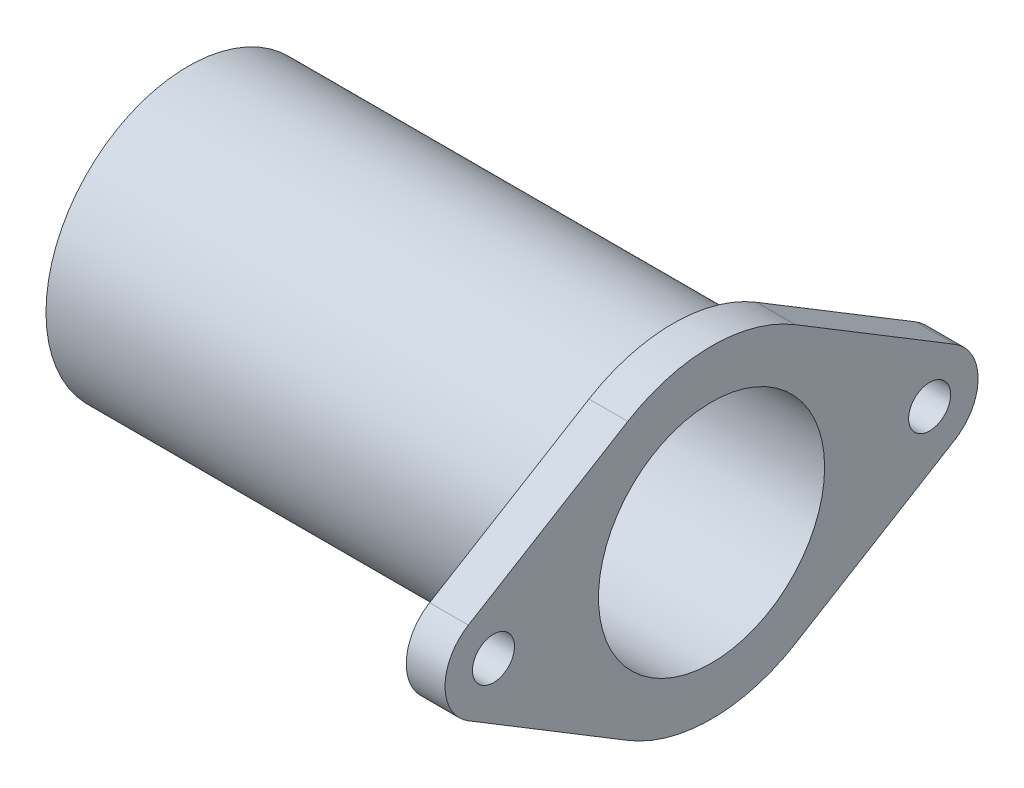
ISO-10303-21;
HEADER;
FILE_DESCRIPTION(('STEP AP214'),'2;1');
FILE_NAME('part.step','',(''),(''),'','','');
FILE_SCHEMA(('AUTOMOTIVE_DESIGN { 1 0 10303 214 1 1 1 1 }'));
ENDSEC;
DATA;
#1=APPLICATION_CONTEXT('core data for automotive mechanical design processes');
#2=APPLICATION_PROTOCOL_DEFINITION('international standard','automotive_design',2000,#1);
#3=PRODUCT_CONTEXT('',#1,'mechanical');
#4=PRODUCT('Part','Part','',(#3));
#5=PRODUCT_RELATED_PRODUCT_CATEGORY('part','',(#4));
#6=PRODUCT_DEFINITION_FORMATION('','',#4);
#7=PRODUCT_DEFINITION_CONTEXT('part definition',#1,'design');
#8=PRODUCT_DEFINITION('design','',#6,#7);
#9=PRODUCT_DEFINITION_SHAPE('','',#8);
#10=(LENGTH_UNIT() NAMED_UNIT(*) SI_UNIT(.MILLI.,.METRE.));
#11=(NAMED_UNIT(*) PLANE_ANGLE_UNIT() SI_UNIT($,.RADIAN.));
#12=(NAMED_UNIT(*) SI_UNIT($,.STERADIAN.) SOLID_ANGLE_UNIT());
#13=UNCERTAINTY_MEASURE_WITH_UNIT(LENGTH_MEASURE(1.E-05),#10,'distance_accuracy_value','');
#14=(GEOMETRIC_REPRESENTATION_CONTEXT(3) GLOBAL_UNCERTAINTY_ASSIGNED_CONTEXT((#13)) GLOBAL_UNIT_ASSIGNED_CONTEXT((#10,
#11,#12)) REPRESENTATION_CONTEXT('',''));
#15=CARTESIAN_POINT('',(0.,0.,0.));
#16=DIRECTION('',(0.,0.,1.));
#17=DIRECTION('',(1.,0.,0.));
#18=AXIS2_PLACEMENT_3D('',#15,#16,#17);
#19=CARTESIAN_POINT('',(150.,0.,0.));
#20=DIRECTION('',(-1.00000000000001,0.,0.));
#21=DIRECTION('',(0.,0.,1.));
#22=AXIS2_PLACEMENT_3D('',#19,#20,#21);
#23=CYLINDRICAL_SURFACE('',#22,44.);
#24=CARTESIAN_POINT('',(150.,0.,0.));
#25=DIRECTION('',(1.00000000000001,0.,0.));
#26=DIRECTION('',(0.,0.,-1.));
#27=AXIS2_PLACEMENT_3D('',#24,#25,#26);
#28=CIRCLE('',#27,44.);
#29=CARTESIAN_POINT('',(150.,0.,-44.));
#30=VERTEX_POINT('',#29);
#31=EDGE_CURVE('E11',#30,#30,#28,.T.);
#32=ORIENTED_EDGE('',*,*,#31,.F.);
#33=EDGE_LOOP('',(#32));
#34=FACE_BOUND('',#33,.T.);
#35=CARTESIAN_POINT('',(0.,0.,0.));
#36=DIRECTION('',(1.00000000000001,0.,0.));
#37=DIRECTION('',(0.,0.,-1.));
#38=AXIS2_PLACEMENT_3D('',#35,#36,#37);
#39=CIRCLE('',#38,44.);
#40=CARTESIAN_POINT('',(0.,0.,-44.));
#41=VERTEX_POINT('',#40);
#42=EDGE_CURVE('E43',#41,#41,#39,.T.);
#43=ORIENTED_EDGE('',*,*,#42,.T.);
#44=EDGE_LOOP('',(#43));
#45=FACE_BOUND('',#44,.T.);
#46=ADVANCED_FACE('F34',(#34,#45),#23,.T.);
#47=CARTESIAN_POINT('',(0.,0.,0.));
#48=DIRECTION('',(1.00000000000001,0.,0.));
#49=DIRECTION('',(0.,0.,-1.));
#50=AXIS2_PLACEMENT_3D('',#47,#48,#49);
#51=PLANE('',#50);
#52=CARTESIAN_POINT('',(0.,0.,0.));
#53=DIRECTION('',(-1.00000000000001,0.,0.));
#54=DIRECTION('',(0.,0.,1.));
#55=AXIS2_PLACEMENT_3D('',#52,#53,#54);
#56=CIRCLE('',#55,25.5);
#57=CARTESIAN_POINT('',(0.,0.,25.5));
#58=VERTEX_POINT('',#57);
#59=EDGE_CURVE('E233',#58,#58,#56,.T.);
#60=ORIENTED_EDGE('',*,*,#59,.F.);
#61=EDGE_LOOP('',(#60));
#62=FACE_BOUND('',#61,.T.);
#63=ORIENTED_EDGE('',*,*,#42,.F.);
#64=EDGE_LOOP('',(#63));
#65=FACE_BOUND('',#64,.T.);
#66=ADVANCED_FACE('F166',(#62,#65),#51,.F.);
#67=CARTESIAN_POINT('',(150.,0.,0.));
#68=DIRECTION('',(1.00000000000001,0.,0.));
#69=DIRECTION('',(0.,0.,-1.));
#70=AXIS2_PLACEMENT_3D('',#67,#68,#69);
#71=PLANE('',#70);
#72=CARTESIAN_POINT('',(150.,0.,67.5));
#73=DIRECTION('',(1.00000000000001,0.,0.));
#74=DIRECTION('',(0.,0.,-1.));
#75=AXIS2_PLACEMENT_3D('',#72,#73,#74);
#76=CIRCLE('',#75,6.5);
#77=CARTESIAN_POINT('',(150.,0.,61.));
#78=VERTEX_POINT('',#77);
#79=EDGE_CURVE('E245',#78,#78,#76,.T.);
#80=ORIENTED_EDGE('',*,*,#79,.T.);
#81=EDGE_LOOP('',(#80));
#82=FACE_BOUND('',#81,.T.);
#83=CARTESIAN_POINT('',(150.,0.,-67.5));
#84=DIRECTION('',(1.00000000000001,0.,0.));
#85=DIRECTION('',(0.,0.,-1.));
#86=AXIS2_PLACEMENT_3D('',#83,#84,#85);
#87=CIRCLE('',#86,6.5);
#88=CARTESIAN_POINT('',(150.,0.,-74.));
#89=VERTEX_POINT('',#88);
#90=EDGE_CURVE('E137',#89,#89,#87,.T.);
#91=ORIENTED_EDGE('',*,*,#90,.T.);
#92=EDGE_LOOP('',(#91));
#93=FACE_BOUND('',#92,.T.);
#94=CARTESIAN_POINT('',(150.,0.,0.));
#95=DIRECTION('',(1.00000000000001,0.,0.));
#96=DIRECTION('',(0.,0.,-1.));
#97=AXIS2_PLACEMENT_3D('',#94,#95,#96);
#98=CIRCLE('',#97,50.);
#99=CARTESIAN_POINT('',(150.,42.7533199282044,-25.9259259259259));
#100=VERTEX_POINT('',#99);
#101=CARTESIAN_POINT('',(150.,42.7533199282044,25.9259259259259));
#102=VERTEX_POINT('',#101);
#103=EDGE_CURVE('E133',#100,#102,#98,.T.);
#104=ORIENTED_EDGE('',*,*,#103,.F.);
#105=DIRECTION('',(0.,0.518518518518524,0.855066398564089));
#106=VECTOR('',#105,1.);
#107=CARTESIAN_POINT('',(150.,42.7533199282044,-25.9259259259259));
#108=LINE('',#107,#106);
#109=CARTESIAN_POINT('',(150.,12.8259959784613,-75.2777777777778));
#110=VERTEX_POINT('',#109);
#111=EDGE_CURVE('E87',#110,#100,#108,.T.);
#112=ORIENTED_EDGE('',*,*,#111,.F.);
#113=CARTESIAN_POINT('',(150.,0.,-67.5));
#114=DIRECTION('',(1.00000000000001,0.,0.));
#115=DIRECTION('',(0.,0.,-1.));
#116=AXIS2_PLACEMENT_3D('',#113,#114,#115);
#117=CIRCLE('',#116,15.);
#118=CARTESIAN_POINT('',(150.,-12.8259959784613,-75.2777777777778));
#119=VERTEX_POINT('',#118);
#120=EDGE_CURVE('E81',#119,#110,#117,.T.);
#121=ORIENTED_EDGE('',*,*,#120,.F.);
#122=DIRECTION('',(0.,0.518518518518525,-0.855066398564089));
#123=VECTOR('',#122,1.);
#124=CARTESIAN_POINT('',(150.,-12.8259959784613,-75.2777777777778));
#125=LINE('',#124,#123);
#126=CARTESIAN_POINT('',(150.000000000002,-42.7533199282044,-25.9259259259259));
#127=VERTEX_POINT('',#126);
#128=EDGE_CURVE('E123',#127,#119,#125,.T.);
#129=ORIENTED_EDGE('',*,*,#128,.F.);
#130=CARTESIAN_POINT('',(150.,0.,0.));
#131=DIRECTION('',(1.00000000000001,0.,0.));
#132=DIRECTION('',(0.,0.,-1.));
#133=AXIS2_PLACEMENT_3D('',#130,#131,#132);
#134=CIRCLE('',#133,50.);
#135=CARTESIAN_POINT('',(150.000000000002,-42.7533199282044,25.9259259259259));
#136=VERTEX_POINT('',#135);
#137=EDGE_CURVE('E143',#136,#127,#134,.T.);
#138=ORIENTED_EDGE('',*,*,#137,.F.);
#139=DIRECTION('',(0.,-0.518518518518524,-0.855066398564089));
#140=VECTOR('',#139,1.);
#141=CARTESIAN_POINT('',(150.,-12.8259959784613,75.2777777777778));
#142=LINE('',#141,#140);
#143=CARTESIAN_POINT('',(150.,-12.8259959784613,75.2777777777778));
#144=VERTEX_POINT('',#143);
#145=EDGE_CURVE('E141',#144,#136,#142,.T.);
#146=ORIENTED_EDGE('',*,*,#145,.F.);
#147=CARTESIAN_POINT('',(150.,0.,67.5));
#148=DIRECTION('',(1.00000000000001,0.,0.));
#149=DIRECTION('',(0.,0.,-1.));
#150=AXIS2_PLACEMENT_3D('',#147,#148,#149);
#151=CIRCLE('',#150,15.);
#152=CARTESIAN_POINT('',(150.,12.8259959784613,75.2777777777778));
#153=VERTEX_POINT('',#152);
#154=EDGE_CURVE('E139',#153,#144,#151,.T.);
#155=ORIENTED_EDGE('',*,*,#154,.F.);
#156=DIRECTION('',(0.,-0.518518518518524,0.855066398564089));
#157=VECTOR('',#156,1.);
#158=CARTESIAN_POINT('',(150.,42.7533199282044,25.9259259259259));
#159=LINE('',#158,#157);
#160=EDGE_CURVE('E136',#102,#153,#159,.T.);
#161=ORIENTED_EDGE('',*,*,#160,.F.);
#162=EDGE_LOOP('',(#104,#112,#121,#129,#138,#146,#155,#161));
#163=FACE_BOUND('',#162,.T.);
#164=ORIENTED_EDGE('',*,*,#31,.T.);
#165=EDGE_LOOP('',(#164));
#166=FACE_BOUND('',#165,.T.);
#167=ADVANCED_FACE('F168',(#82,#93,#163,#166),#71,.F.);
#168=CARTESIAN_POINT('',(162.,0.,0.));
#169=DIRECTION('',(-1.00000000000001,0.,0.));
#170=DIRECTION('',(0.,0.,1.));
#171=AXIS2_PLACEMENT_3D('',#168,#169,#170);
#172=CYLINDRICAL_SURFACE('',#171,50.);
#173=ORIENTED_EDGE('',*,*,#103,.T.);
#174=DIRECTION('',(-1.00000000000001,0.,0.));
#175=VECTOR('',#174,1.);
#176=CARTESIAN_POINT('',(162.,42.7533199282044,25.9259259259259));
#177=LINE('',#176,#175);
#178=CARTESIAN_POINT('',(162.,42.7533199282044,25.9259259259259));
#179=VERTEX_POINT('',#178);
#180=EDGE_CURVE('E161',#179,#102,#177,.T.);
#181=ORIENTED_EDGE('',*,*,#180,.F.);
#182=CARTESIAN_POINT('',(162.,0.,0.));
#183=DIRECTION('',(1.00000000000001,0.,0.));
#184=DIRECTION('',(0.,0.,-1.));
#185=AXIS2_PLACEMENT_3D('',#182,#183,#184);
#186=CIRCLE('',#185,50.);
#187=CARTESIAN_POINT('',(162.,42.7533199282044,-25.9259259259259));
#188=VERTEX_POINT('',#187);
#189=EDGE_CURVE('E148',#188,#179,#186,.T.);
#190=ORIENTED_EDGE('',*,*,#189,.F.);
#191=DIRECTION('',(-1.00000000000001,0.,0.));
#192=VECTOR('',#191,1.);
#193=CARTESIAN_POINT('',(162.,42.7533199282044,-25.9259259259259));
#194=LINE('',#193,#192);
#195=EDGE_CURVE('E129',#188,#100,#194,.T.);
#196=ORIENTED_EDGE('',*,*,#195,.T.);
#197=EDGE_LOOP('',(#173,#181,#190,#196));
#198=FACE_BOUND('',#197,.T.);
#199=ADVANCED_FACE('F174',(#198),#172,.T.);
#200=CARTESIAN_POINT('',(162.,42.7533199282044,25.9259259259259));
#201=DIRECTION('',(0.,-0.8550663985641,-0.518518518518518));
#202=DIRECTION('',(0.,0.518518518518524,-0.855066398564089));
#203=AXIS2_PLACEMENT_3D('',#200,#201,#202);
#204=PLANE('',#203);
#205=ORIENTED_EDGE('',*,*,#160,.T.);
#206=DIRECTION('',(-1.00000000000001,0.,0.));
#207=VECTOR('',#206,1.);
#208=CARTESIAN_POINT('',(162.,12.8259959784613,75.2777777777778));
#209=LINE('',#208,#207);
#210=CARTESIAN_POINT('',(162.,12.8259959784613,75.2777777777778));
#211=VERTEX_POINT('',#210);
#212=EDGE_CURVE('E158',#211,#153,#209,.T.);
#213=ORIENTED_EDGE('',*,*,#212,.F.);
#214=DIRECTION('',(0.,-0.518518518518524,0.855066398564089));
#215=VECTOR('',#214,1.);
#216=CARTESIAN_POINT('',(162.,42.7533199282044,25.9259259259259));
#217=LINE('',#216,#215);
#218=EDGE_CURVE('E96',#179,#211,#217,.T.);
#219=ORIENTED_EDGE('',*,*,#218,.F.);
#220=ORIENTED_EDGE('',*,*,#180,.T.);
#221=EDGE_LOOP('',(#205,#213,#219,#220));
#222=FACE_BOUND('',#221,.T.);
#223=ADVANCED_FACE('F182',(#222),#204,.F.);
#224=CARTESIAN_POINT('',(162.,0.,67.5));
#225=DIRECTION('',(-1.00000000000001,0.,0.));
#226=DIRECTION('',(0.,0.,1.));
#227=AXIS2_PLACEMENT_3D('',#224,#225,#226);
#228=CYLINDRICAL_SURFACE('',#227,15.);
#229=ORIENTED_EDGE('',*,*,#154,.T.);
#230=DIRECTION('',(-1.00000000000001,0.,0.));
#231=VECTOR('',#230,1.);
#232=CARTESIAN_POINT('',(162.,-12.8259959784613,75.2777777777778));
#233=LINE('',#232,#231);
#234=CARTESIAN_POINT('',(162.,-12.8259959784613,75.2777777777778));
#235=VERTEX_POINT('',#234);
#236=EDGE_CURVE('E155',#235,#144,#233,.T.);
#237=ORIENTED_EDGE('',*,*,#236,.F.);
#238=CARTESIAN_POINT('',(162.,0.,67.5));
#239=DIRECTION('',(1.00000000000001,0.,0.));
#240=DIRECTION('',(0.,0.,-1.));
#241=AXIS2_PLACEMENT_3D('',#238,#239,#240);
#242=CIRCLE('',#241,15.);
#243=EDGE_CURVE('E255',#211,#235,#242,.T.);
#244=ORIENTED_EDGE('',*,*,#243,.F.);
#245=ORIENTED_EDGE('',*,*,#212,.T.);
#246=EDGE_LOOP('',(#229,#237,#244,#245));
#247=FACE_BOUND('',#246,.T.);
#248=ADVANCED_FACE('F186',(#247),#228,.T.);
#249=CARTESIAN_POINT('',(162.,-12.8259959784613,75.2777777777778));
#250=DIRECTION('',(0.,0.855066398564101,-0.518518518518518));
#251=DIRECTION('',(0.,0.518518518518524,0.855066398564089));
#252=AXIS2_PLACEMENT_3D('',#249,#250,#251);
#253=PLANE('',#252);
#254=ORIENTED_EDGE('',*,*,#145,.T.);
#255=DIRECTION('',(-1.00000000000001,0.,0.));
#256=VECTOR('',#255,1.);
#257=CARTESIAN_POINT('',(162.000000000002,-42.7533199282045,25.9259259259259));
#258=LINE('',#257,#256);
#259=CARTESIAN_POINT('',(162.000000000002,-42.7533199282045,25.9259259259259));
#260=VERTEX_POINT('',#259);
#261=EDGE_CURVE('E152',#260,#136,#258,.T.);
#262=ORIENTED_EDGE('',*,*,#261,.F.);
#263=DIRECTION('',(0.,-0.518518518518524,-0.855066398564089));
#264=VECTOR('',#263,1.);
#265=CARTESIAN_POINT('',(162.,-12.8259959784613,75.2777777777778));
#266=LINE('',#265,#264);
#267=EDGE_CURVE('E257',#235,#260,#266,.T.);
#268=ORIENTED_EDGE('',*,*,#267,.F.);
#269=ORIENTED_EDGE('',*,*,#236,.T.);
#270=EDGE_LOOP('',(#254,#262,#268,#269));
#271=FACE_BOUND('',#270,.T.);
#272=ADVANCED_FACE('F189',(#271),#253,.F.);
#273=CARTESIAN_POINT('',(162.,0.,0.));
#274=DIRECTION('',(-1.00000000000001,0.,0.));
#275=DIRECTION('',(0.,0.,1.));
#276=AXIS2_PLACEMENT_3D('',#273,#274,#275);
#277=CYLINDRICAL_SURFACE('',#276,50.);
#278=ORIENTED_EDGE('',*,*,#137,.T.);
#279=DIRECTION('',(-1.00000000000001,0.,0.));
#280=VECTOR('',#279,1.);
#281=CARTESIAN_POINT('',(162.000000000002,-42.7533199282045,-25.9259259259259));
#282=LINE('',#281,#280);
#283=CARTESIAN_POINT('',(162.000000000002,-42.7533199282045,-25.9259259259259));
#284=VERTEX_POINT('',#283);
#285=EDGE_CURVE('E124',#284,#127,#282,.T.);
#286=ORIENTED_EDGE('',*,*,#285,.F.);
#287=CARTESIAN_POINT('',(162.,0.,0.));
#288=DIRECTION('',(1.00000000000001,0.,0.));
#289=DIRECTION('',(0.,0.,-1.));
#290=AXIS2_PLACEMENT_3D('',#287,#288,#289);
#291=CIRCLE('',#290,50.);
#292=EDGE_CURVE('E115',#260,#284,#291,.T.);
#293=ORIENTED_EDGE('',*,*,#292,.F.);
#294=ORIENTED_EDGE('',*,*,#261,.T.);
#295=EDGE_LOOP('',(#278,#286,#293,#294));
#296=FACE_BOUND('',#295,.T.);
#297=ADVANCED_FACE('F193',(#296),#277,.T.);
#298=CARTESIAN_POINT('',(162.,-12.8259959784613,-75.2777777777778));
#299=DIRECTION('',(0.,0.8550663985641,0.518518518518518));
#300=DIRECTION('',(0.,-0.518518518518525,0.855066398564089));
#301=AXIS2_PLACEMENT_3D('',#298,#299,#300);
#302=PLANE('',#301);
#303=ORIENTED_EDGE('',*,*,#128,.T.);
#304=DIRECTION('',(-1.00000000000001,0.,0.));
#305=VECTOR('',#304,1.);
#306=CARTESIAN_POINT('',(162.,-12.8259959784613,-75.2777777777778));
#307=LINE('',#306,#305);
#308=CARTESIAN_POINT('',(162.,-12.8259959784613,-75.2777777777778));
#309=VERTEX_POINT('',#308);
#310=EDGE_CURVE('E120',#309,#119,#307,.T.);
#311=ORIENTED_EDGE('',*,*,#310,.F.);
#312=DIRECTION('',(0.,0.518518518518525,-0.855066398564089));
#313=VECTOR('',#312,1.);
#314=CARTESIAN_POINT('',(162.,-12.8259959784613,-75.2777777777778));
#315=LINE('',#314,#313);
#316=EDGE_CURVE('E109',#284,#309,#315,.T.);
#317=ORIENTED_EDGE('',*,*,#316,.F.);
#318=ORIENTED_EDGE('',*,*,#285,.T.);
#319=EDGE_LOOP('',(#303,#311,#317,#318));
#320=FACE_BOUND('',#319,.T.);
#321=ADVANCED_FACE('F121',(#320),#302,.F.);
#322=CARTESIAN_POINT('',(162.,0.,-67.5));
#323=DIRECTION('',(-1.00000000000001,0.,0.));
#324=DIRECTION('',(0.,0.,1.));
#325=AXIS2_PLACEMENT_3D('',#322,#323,#324);
#326=CYLINDRICAL_SURFACE('',#325,15.);
#327=ORIENTED_EDGE('',*,*,#120,.T.);
#328=DIRECTION('',(-1.00000000000001,0.,0.));
#329=VECTOR('',#328,1.);
#330=CARTESIAN_POINT('',(162.,12.8259959784613,-75.2777777777778));
#331=LINE('',#330,#329);
#332=CARTESIAN_POINT('',(162.,12.8259959784613,-75.2777777777778));
#333=VERTEX_POINT('',#332);
#334=EDGE_CURVE('E125',#333,#110,#331,.T.);
#335=ORIENTED_EDGE('',*,*,#334,.F.);
#336=CARTESIAN_POINT('',(162.,0.,-67.5));
#337=DIRECTION('',(1.00000000000001,0.,0.));
#338=DIRECTION('',(0.,0.,-1.));
#339=AXIS2_PLACEMENT_3D('',#336,#337,#338);
#340=CIRCLE('',#339,15.);
#341=EDGE_CURVE('E113',#309,#333,#340,.T.);
#342=ORIENTED_EDGE('',*,*,#341,.F.);
#343=ORIENTED_EDGE('',*,*,#310,.T.);
#344=EDGE_LOOP('',(#327,#335,#342,#343));
#345=FACE_BOUND('',#344,.T.);
#346=ADVANCED_FACE('F127',(#345),#326,.T.);
#347=CARTESIAN_POINT('',(162.,42.7533199282044,-25.9259259259259));
#348=DIRECTION('',(0.,-0.855066398564101,0.518518518518519));
#349=DIRECTION('',(0.,-0.518518518518525,-0.855066398564089));
#350=AXIS2_PLACEMENT_3D('',#347,#348,#349);
#351=PLANE('',#350);
#352=ORIENTED_EDGE('',*,*,#111,.T.);
#353=ORIENTED_EDGE('',*,*,#195,.F.);
#354=DIRECTION('',(0.,0.518518518518524,0.855066398564089));
#355=VECTOR('',#354,1.);
#356=CARTESIAN_POINT('',(162.,42.7533199282044,-25.9259259259259));
#357=LINE('',#356,#355);
#358=EDGE_CURVE('E52',#333,#188,#357,.T.);
#359=ORIENTED_EDGE('',*,*,#358,.F.);
#360=ORIENTED_EDGE('',*,*,#334,.T.);
#361=EDGE_LOOP('',(#352,#353,#359,#360));
#362=FACE_BOUND('',#361,.T.);
#363=ADVANCED_FACE('F202',(#362),#351,.F.);
#364=CARTESIAN_POINT('',(162.,0.,0.));
#365=DIRECTION('',(1.00000000000001,0.,0.));
#366=DIRECTION('',(0.,0.,-1.));
#367=AXIS2_PLACEMENT_3D('',#364,#365,#366);
#368=PLANE('',#367);
#369=CARTESIAN_POINT('',(162.,0.,0.));
#370=DIRECTION('',(1.00000000000001,0.,0.));
#371=DIRECTION('',(0.,0.,-1.));
#372=AXIS2_PLACEMENT_3D('',#369,#370,#371);
#373=CIRCLE('',#372,35.);
#374=CARTESIAN_POINT('',(162.,0.,-35.));
#375=VERTEX_POINT('',#374);
#376=EDGE_CURVE('E235',#375,#375,#373,.T.);
#377=ORIENTED_EDGE('',*,*,#376,.F.);
#378=EDGE_LOOP('',(#377));
#379=FACE_BOUND('',#378,.T.);
#380=CARTESIAN_POINT('',(162.,0.,67.5));
#381=DIRECTION('',(1.00000000000001,0.,0.));
#382=DIRECTION('',(0.,0.,-1.));
#383=AXIS2_PLACEMENT_3D('',#380,#381,#382);
#384=CIRCLE('',#383,6.5);
#385=CARTESIAN_POINT('',(162.,0.,61.));
#386=VERTEX_POINT('',#385);
#387=EDGE_CURVE('E240',#386,#386,#384,.T.);
#388=ORIENTED_EDGE('',*,*,#387,.F.);
#389=EDGE_LOOP('',(#388));
#390=FACE_BOUND('',#389,.T.);
#391=CARTESIAN_POINT('',(162.,0.,-67.5));
#392=DIRECTION('',(1.00000000000001,0.,0.));
#393=DIRECTION('',(0.,0.,-1.));
#394=AXIS2_PLACEMENT_3D('',#391,#392,#393);
#395=CIRCLE('',#394,6.5);
#396=CARTESIAN_POINT('',(162.,0.,-74.));
#397=VERTEX_POINT('',#396);
#398=EDGE_CURVE('E248',#397,#397,#395,.T.);
#399=ORIENTED_EDGE('',*,*,#398,.F.);
#400=EDGE_LOOP('',(#399));
#401=FACE_BOUND('',#400,.T.);
#402=ORIENTED_EDGE('',*,*,#189,.T.);
#403=ORIENTED_EDGE('',*,*,#218,.T.);
#404=ORIENTED_EDGE('',*,*,#243,.T.);
#405=ORIENTED_EDGE('',*,*,#267,.T.);
#406=ORIENTED_EDGE('',*,*,#292,.T.);
#407=ORIENTED_EDGE('',*,*,#316,.T.);
#408=ORIENTED_EDGE('',*,*,#341,.T.);
#409=ORIENTED_EDGE('',*,*,#358,.T.);
#410=EDGE_LOOP('',(#402,#403,#404,#405,#406,#407,#408,#409));
#411=FACE_BOUND('',#410,.T.);
#412=ADVANCED_FACE('F111',(#379,#390,#401,#411),#368,.T.);
#413=CARTESIAN_POINT('',(82.,0.,-67.5));
#414=DIRECTION('',(1.00000000000001,0.,0.));
#415=DIRECTION('',(0.,0.,-1.));
#416=AXIS2_PLACEMENT_3D('',#413,#414,#415);
#417=CYLINDRICAL_SURFACE('',#416,6.5);
#418=ORIENTED_EDGE('',*,*,#398,.T.);
#419=EDGE_LOOP('',(#418));
#420=FACE_BOUND('',#419,.T.);
#421=ORIENTED_EDGE('',*,*,#90,.F.);
#422=EDGE_LOOP('',(#421));
#423=FACE_BOUND('',#422,.T.);
#424=ADVANCED_FACE('F207',(#420,#423),#417,.F.);
#425=CARTESIAN_POINT('',(82.,0.,67.5));
#426=DIRECTION('',(1.00000000000001,0.,0.));
#427=DIRECTION('',(0.,0.,-1.));
#428=AXIS2_PLACEMENT_3D('',#425,#426,#427);
#429=CYLINDRICAL_SURFACE('',#428,6.5);
#430=ORIENTED_EDGE('',*,*,#387,.T.);
#431=EDGE_LOOP('',(#430));
#432=FACE_BOUND('',#431,.T.);
#433=ORIENTED_EDGE('',*,*,#79,.F.);
#434=EDGE_LOOP('',(#433));
#435=FACE_BOUND('',#434,.T.);
#436=ADVANCED_FACE('F211',(#432,#435),#429,.F.);
#437=CARTESIAN_POINT('',(15.,0.,0.));
#438=DIRECTION('',(1.00000000000001,0.,0.));
#439=DIRECTION('',(0.,0.,-1.));
#440=AXIS2_PLACEMENT_3D('',#437,#438,#439);
#441=CYLINDRICAL_SURFACE('',#440,35.);
#442=CARTESIAN_POINT('',(15.,0.,0.));
#443=DIRECTION('',(1.00000000000001,0.,0.));
#444=DIRECTION('',(0.,0.,-1.));
#445=AXIS2_PLACEMENT_3D('',#442,#443,#444);
#446=CIRCLE('',#445,35.);
#447=CARTESIAN_POINT('',(15.,0.,-35.));
#448=VERTEX_POINT('',#447);
#449=EDGE_CURVE('E237',#448,#448,#446,.T.);
#450=ORIENTED_EDGE('',*,*,#449,.F.);
#451=EDGE_LOOP('',(#450));
#452=FACE_BOUND('',#451,.T.);
#453=ORIENTED_EDGE('',*,*,#376,.T.);
#454=EDGE_LOOP('',(#453));
#455=FACE_BOUND('',#454,.T.);
#456=ADVANCED_FACE('F215',(#452,#455),#441,.F.);
#457=CARTESIAN_POINT('',(15.,0.,0.));
#458=DIRECTION('',(1.00000000000001,0.,0.));
#459=DIRECTION('',(0.,0.,-1.));
#460=AXIS2_PLACEMENT_3D('',#457,#458,#459);
#461=PLANE('',#460);
#462=CARTESIAN_POINT('',(15.,0.,0.));
#463=DIRECTION('',(1.00000000000001,0.,0.));
#464=DIRECTION('',(0.,0.,-1.));
#465=AXIS2_PLACEMENT_3D('',#462,#463,#464);
#466=CIRCLE('',#465,25.5);
#467=CARTESIAN_POINT('',(15.,0.,-25.5));
#468=VERTEX_POINT('',#467);
#469=EDGE_CURVE('E37',#468,#468,#466,.T.);
#470=ORIENTED_EDGE('',*,*,#469,.F.);
#471=EDGE_LOOP('',(#470));
#472=FACE_BOUND('',#471,.T.);
#473=ORIENTED_EDGE('',*,*,#449,.T.);
#474=EDGE_LOOP('',(#473));
#475=FACE_BOUND('',#474,.T.);
#476=ADVANCED_FACE('F219',(#472,#475),#461,.T.);
#477=CARTESIAN_POINT('',(67.0000000000001,0.,0.));
#478=DIRECTION('',(-1.00000000000001,0.,0.));
#479=DIRECTION('',(0.,0.,1.));
#480=AXIS2_PLACEMENT_3D('',#477,#478,#479);
#481=CYLINDRICAL_SURFACE('',#480,25.5);
#482=ORIENTED_EDGE('',*,*,#469,.T.);
#483=EDGE_LOOP('',(#482));
#484=FACE_BOUND('',#483,.T.);
#485=ORIENTED_EDGE('',*,*,#59,.T.);
#486=EDGE_LOOP('',(#485));
#487=FACE_BOUND('',#486,.T.);
#488=ADVANCED_FACE('F223',(#484,#487),#481,.F.);
#489=CLOSED_SHELL('',(#46,#66,#167,#199,#223,#248,#272,#297,#321,#346,#363,#412,#424,#436,#456,
#476,#488));
#490=MANIFOLD_SOLID_BREP('B2',#489);
#491=ADVANCED_BREP_SHAPE_REPRESENTATION('',(#18,#490),#14);
#492=SHAPE_DEFINITION_REPRESENTATION(#9,#491);
ENDSEC;
END-ISO-10303-21;
